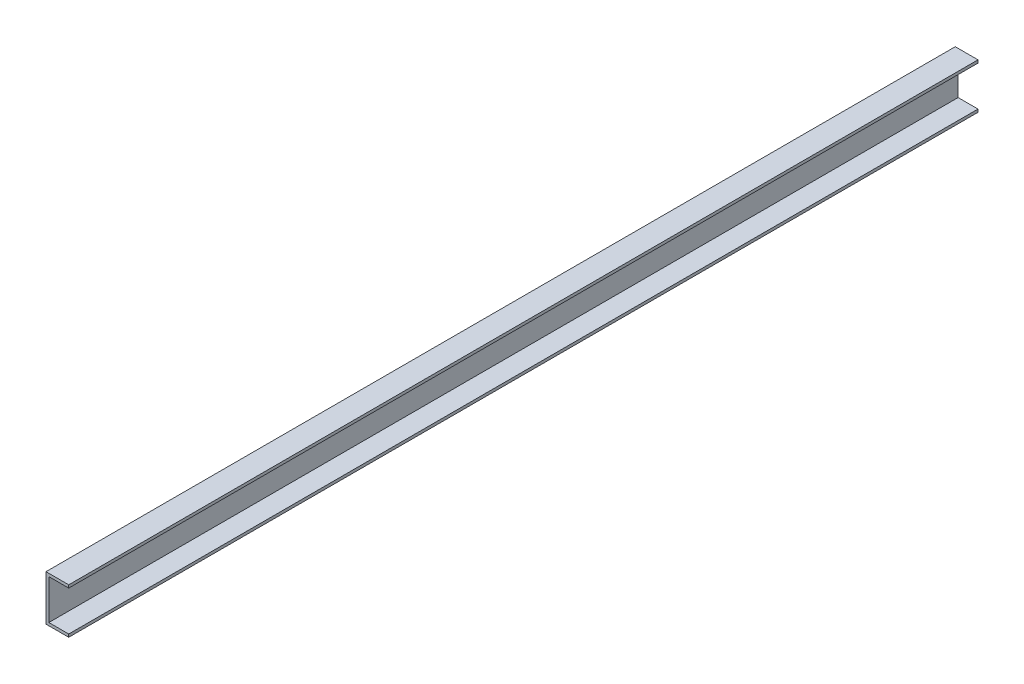
ISO-10303-21;
HEADER;
FILE_DESCRIPTION(('STEP AP214'),'2;1');
FILE_NAME('part.step','',(''),(''),'','','');
FILE_SCHEMA(('AUTOMOTIVE_DESIGN { 1 0 10303 214 1 1 1 1 }'));
ENDSEC;
DATA;
#1=APPLICATION_CONTEXT('core data for automotive mechanical design processes');
#2=APPLICATION_PROTOCOL_DEFINITION('international standard','automotive_design',2000,#1);
#3=PRODUCT_CONTEXT('',#1,'mechanical');
#4=PRODUCT('Part','Part','',(#3));
#5=PRODUCT_RELATED_PRODUCT_CATEGORY('part','',(#4));
#6=PRODUCT_DEFINITION_FORMATION('','',#4);
#7=PRODUCT_DEFINITION_CONTEXT('part definition',#1,'design');
#8=PRODUCT_DEFINITION('design','',#6,#7);
#9=PRODUCT_DEFINITION_SHAPE('','',#8);
#10=(LENGTH_UNIT() NAMED_UNIT(*) SI_UNIT(.MILLI.,.METRE.));
#11=(NAMED_UNIT(*) PLANE_ANGLE_UNIT() SI_UNIT($,.RADIAN.));
#12=(NAMED_UNIT(*) SI_UNIT($,.STERADIAN.) SOLID_ANGLE_UNIT());
#13=UNCERTAINTY_MEASURE_WITH_UNIT(LENGTH_MEASURE(1.E-05),#10,'distance_accuracy_value','');
#14=(GEOMETRIC_REPRESENTATION_CONTEXT(3) GLOBAL_UNCERTAINTY_ASSIGNED_CONTEXT((#13)) GLOBAL_UNIT_ASSIGNED_CONTEXT((#10,
#11,#12)) REPRESENTATION_CONTEXT('',''));
#15=CARTESIAN_POINT('',(0.,0.,0.));
#16=DIRECTION('',(0.,0.,1.));
#17=DIRECTION('',(1.,0.,0.));
#18=AXIS2_PLACEMENT_3D('',#15,#16,#17);
#19=CARTESIAN_POINT('',(0.,0.,1016.));
#20=DIRECTION('',(0.,1.,0.));
#21=DIRECTION('',(0.,0.,1.));
#22=AXIS2_PLACEMENT_3D('',#19,#20,#21);
#23=PLANE('',#22);
#24=DIRECTION('',(1.,0.,0.));
#25=VECTOR('',#24,1.);
#26=CARTESIAN_POINT('',(0.,0.,0.));
#27=LINE('',#26,#25);
#28=CARTESIAN_POINT('',(0.,0.,0.));
#29=VERTEX_POINT('',#28);
#30=CARTESIAN_POINT('',(25.4,0.,0.));
#31=VERTEX_POINT('',#30);
#32=EDGE_CURVE('E100',#29,#31,#27,.T.);
#33=ORIENTED_EDGE('',*,*,#32,.T.);
#34=DIRECTION('',(0.,0.,-1.));
#35=VECTOR('',#34,1.);
#36=CARTESIAN_POINT('',(25.4,0.,1016.));
#37=LINE('',#36,#35);
#38=CARTESIAN_POINT('',(25.4,0.,1016.));
#39=VERTEX_POINT('',#38);
#40=EDGE_CURVE('E11',#39,#31,#37,.T.);
#41=ORIENTED_EDGE('',*,*,#40,.F.);
#42=DIRECTION('',(1.,0.,0.));
#43=VECTOR('',#42,1.);
#44=CARTESIAN_POINT('',(0.,0.,1016.));
#45=LINE('',#44,#43);
#46=CARTESIAN_POINT('',(0.,0.,1016.));
#47=VERTEX_POINT('',#46);
#48=EDGE_CURVE('E127',#47,#39,#45,.T.);
#49=ORIENTED_EDGE('',*,*,#48,.F.);
#50=DIRECTION('',(0.,0.,-1.));
#51=VECTOR('',#50,1.);
#52=CARTESIAN_POINT('',(0.,0.,1016.));
#53=LINE('',#52,#51);
#54=EDGE_CURVE('E113',#47,#29,#53,.T.);
#55=ORIENTED_EDGE('',*,*,#54,.T.);
#56=EDGE_LOOP('',(#33,#41,#49,#55));
#57=FACE_BOUND('',#56,.T.);
#58=ADVANCED_FACE('F32',(#57),#23,.F.);
#59=CARTESIAN_POINT('',(25.4,0.,1016.));
#60=DIRECTION('',(-1.,0.,0.));
#61=DIRECTION('',(0.,0.,1.));
#62=AXIS2_PLACEMENT_3D('',#59,#60,#61);
#63=PLANE('',#62);
#64=DIRECTION('',(0.,1.,0.));
#65=VECTOR('',#64,1.);
#66=CARTESIAN_POINT('',(25.4,0.,0.));
#67=LINE('',#66,#65);
#68=CARTESIAN_POINT('',(25.4,3.17499999999999,0.));
#69=VERTEX_POINT('',#68);
#70=EDGE_CURVE('E96',#31,#69,#67,.T.);
#71=ORIENTED_EDGE('',*,*,#70,.T.);
#72=DIRECTION('',(0.,0.,-1.));
#73=VECTOR('',#72,1.);
#74=CARTESIAN_POINT('',(25.4,3.17499999999999,1016.));
#75=LINE('',#74,#73);
#76=CARTESIAN_POINT('',(25.4,3.17499999999999,1016.));
#77=VERTEX_POINT('',#76);
#78=EDGE_CURVE('E39',#77,#69,#75,.T.);
#79=ORIENTED_EDGE('',*,*,#78,.F.);
#80=DIRECTION('',(0.,1.,0.));
#81=VECTOR('',#80,1.);
#82=CARTESIAN_POINT('',(25.4,0.,1016.));
#83=LINE('',#82,#81);
#84=EDGE_CURVE('E109',#39,#77,#83,.T.);
#85=ORIENTED_EDGE('',*,*,#84,.F.);
#86=ORIENTED_EDGE('',*,*,#40,.T.);
#87=EDGE_LOOP('',(#71,#79,#85,#86));
#88=FACE_BOUND('',#87,.T.);
#89=ADVANCED_FACE('F108',(#88),#63,.F.);
#90=CARTESIAN_POINT('',(25.4,3.17499999999999,1016.));
#91=DIRECTION('',(0.,-1.,0.));
#92=DIRECTION('',(1.,0.,0.));
#93=AXIS2_PLACEMENT_3D('',#90,#91,#92);
#94=PLANE('',#93);
#95=DIRECTION('',(-1.,0.,0.));
#96=VECTOR('',#95,1.);
#97=CARTESIAN_POINT('',(25.4,3.17499999999999,0.));
#98=LINE('',#97,#96);
#99=CARTESIAN_POINT('',(3.175,3.17499999999999,0.));
#100=VERTEX_POINT('',#99);
#101=EDGE_CURVE('E102',#69,#100,#98,.T.);
#102=ORIENTED_EDGE('',*,*,#101,.T.);
#103=DIRECTION('',(0.,0.,-1.));
#104=VECTOR('',#103,1.);
#105=CARTESIAN_POINT('',(3.175,3.17499999999999,1016.));
#106=LINE('',#105,#104);
#107=CARTESIAN_POINT('',(3.175,3.17499999999999,1016.));
#108=VERTEX_POINT('',#107);
#109=EDGE_CURVE('E153',#108,#100,#106,.T.);
#110=ORIENTED_EDGE('',*,*,#109,.F.);
#111=DIRECTION('',(-1.,0.,0.));
#112=VECTOR('',#111,1.);
#113=CARTESIAN_POINT('',(25.4,3.17499999999999,1016.));
#114=LINE('',#113,#112);
#115=EDGE_CURVE('E130',#77,#108,#114,.T.);
#116=ORIENTED_EDGE('',*,*,#115,.F.);
#117=ORIENTED_EDGE('',*,*,#78,.T.);
#118=EDGE_LOOP('',(#102,#110,#116,#117));
#119=FACE_BOUND('',#118,.T.);
#120=ADVANCED_FACE('F157',(#119),#94,.F.);
#121=CARTESIAN_POINT('',(3.17499999999999,47.625,1016.));
#122=DIRECTION('',(-1.,0.,0.));
#123=DIRECTION('',(0.,-1.,0.));
#124=AXIS2_PLACEMENT_3D('',#121,#122,#123);
#125=PLANE('',#124);
#126=DIRECTION('',(0.,1.,0.));
#127=VECTOR('',#126,1.);
#128=CARTESIAN_POINT('',(3.17499999999999,47.625,0.));
#129=LINE('',#128,#127);
#130=CARTESIAN_POINT('',(3.17499999999999,47.625,0.));
#131=VERTEX_POINT('',#130);
#132=EDGE_CURVE('E117',#100,#131,#129,.T.);
#133=ORIENTED_EDGE('',*,*,#132,.T.);
#134=DIRECTION('',(0.,0.,-1.));
#135=VECTOR('',#134,1.);
#136=CARTESIAN_POINT('',(3.17499999999999,47.625,1016.));
#137=LINE('',#136,#135);
#138=CARTESIAN_POINT('',(3.17499999999999,47.625,1016.));
#139=VERTEX_POINT('',#138);
#140=EDGE_CURVE('E150',#139,#131,#137,.T.);
#141=ORIENTED_EDGE('',*,*,#140,.F.);
#142=DIRECTION('',(0.,1.,0.));
#143=VECTOR('',#142,1.);
#144=CARTESIAN_POINT('',(3.17499999999999,47.625,1016.));
#145=LINE('',#144,#143);
#146=EDGE_CURVE('E132',#108,#139,#145,.T.);
#147=ORIENTED_EDGE('',*,*,#146,.F.);
#148=ORIENTED_EDGE('',*,*,#109,.T.);
#149=EDGE_LOOP('',(#133,#141,#147,#148));
#150=FACE_BOUND('',#149,.T.);
#151=ADVANCED_FACE('F165',(#150),#125,.F.);
#152=CARTESIAN_POINT('',(25.4,47.625,1016.));
#153=DIRECTION('',(0.,1.,0.));
#154=DIRECTION('',(0.,0.,1.));
#155=AXIS2_PLACEMENT_3D('',#152,#153,#154);
#156=PLANE('',#155);
#157=DIRECTION('',(1.,0.,0.));
#158=VECTOR('',#157,1.);
#159=CARTESIAN_POINT('',(25.4,47.625,0.));
#160=LINE('',#159,#158);
#161=CARTESIAN_POINT('',(25.4,47.625,0.));
#162=VERTEX_POINT('',#161);
#163=EDGE_CURVE('E119',#131,#162,#160,.T.);
#164=ORIENTED_EDGE('',*,*,#163,.T.);
#165=DIRECTION('',(0.,0.,-1.));
#166=VECTOR('',#165,1.);
#167=CARTESIAN_POINT('',(25.4,47.625,1016.));
#168=LINE('',#167,#166);
#169=CARTESIAN_POINT('',(25.4,47.625,1016.));
#170=VERTEX_POINT('',#169);
#171=EDGE_CURVE('E147',#170,#162,#168,.T.);
#172=ORIENTED_EDGE('',*,*,#171,.F.);
#173=DIRECTION('',(1.,0.,0.));
#174=VECTOR('',#173,1.);
#175=CARTESIAN_POINT('',(25.4,47.625,1016.));
#176=LINE('',#175,#174);
#177=EDGE_CURVE('E134',#139,#170,#176,.T.);
#178=ORIENTED_EDGE('',*,*,#177,.F.);
#179=ORIENTED_EDGE('',*,*,#140,.T.);
#180=EDGE_LOOP('',(#164,#172,#178,#179));
#181=FACE_BOUND('',#180,.T.);
#182=ADVANCED_FACE('F168',(#181),#156,.F.);
#183=CARTESIAN_POINT('',(25.4,50.8,1016.));
#184=DIRECTION('',(-1.,0.,0.));
#185=DIRECTION('',(0.,-1.,0.));
#186=AXIS2_PLACEMENT_3D('',#183,#184,#185);
#187=PLANE('',#186);
#188=DIRECTION('',(0.,1.,0.));
#189=VECTOR('',#188,1.);
#190=CARTESIAN_POINT('',(25.4,50.8,0.));
#191=LINE('',#190,#189);
#192=CARTESIAN_POINT('',(25.4,50.8,0.));
#193=VERTEX_POINT('',#192);
#194=EDGE_CURVE('E121',#162,#193,#191,.T.);
#195=ORIENTED_EDGE('',*,*,#194,.T.);
#196=DIRECTION('',(0.,0.,-1.));
#197=VECTOR('',#196,1.);
#198=CARTESIAN_POINT('',(25.4,50.8,1016.));
#199=LINE('',#198,#197);
#200=CARTESIAN_POINT('',(25.4,50.8,1016.));
#201=VERTEX_POINT('',#200);
#202=EDGE_CURVE('E144',#201,#193,#199,.T.);
#203=ORIENTED_EDGE('',*,*,#202,.F.);
#204=DIRECTION('',(0.,1.,0.));
#205=VECTOR('',#204,1.);
#206=CARTESIAN_POINT('',(25.4,50.8,1016.));
#207=LINE('',#206,#205);
#208=EDGE_CURVE('E136',#170,#201,#207,.T.);
#209=ORIENTED_EDGE('',*,*,#208,.F.);
#210=ORIENTED_EDGE('',*,*,#171,.T.);
#211=EDGE_LOOP('',(#195,#203,#209,#210));
#212=FACE_BOUND('',#211,.T.);
#213=ADVANCED_FACE('F173',(#212),#187,.F.);
#214=CARTESIAN_POINT('',(0.,50.8,1016.));
#215=DIRECTION('',(0.,-1.,0.));
#216=DIRECTION('',(0.,0.,-1.));
#217=AXIS2_PLACEMENT_3D('',#214,#215,#216);
#218=PLANE('',#217);
#219=DIRECTION('',(-1.,0.,0.));
#220=VECTOR('',#219,1.);
#221=CARTESIAN_POINT('',(0.,50.8,0.));
#222=LINE('',#221,#220);
#223=CARTESIAN_POINT('',(0.,50.8,0.));
#224=VERTEX_POINT('',#223);
#225=EDGE_CURVE('E123',#193,#224,#222,.T.);
#226=ORIENTED_EDGE('',*,*,#225,.T.);
#227=DIRECTION('',(0.,0.,-1.));
#228=VECTOR('',#227,1.);
#229=CARTESIAN_POINT('',(0.,50.8,1016.));
#230=LINE('',#229,#228);
#231=CARTESIAN_POINT('',(0.,50.8,1016.));
#232=VERTEX_POINT('',#231);
#233=EDGE_CURVE('E141',#232,#224,#230,.T.);
#234=ORIENTED_EDGE('',*,*,#233,.F.);
#235=DIRECTION('',(-1.,0.,0.));
#236=VECTOR('',#235,1.);
#237=CARTESIAN_POINT('',(0.,50.8,1016.));
#238=LINE('',#237,#236);
#239=EDGE_CURVE('E51',#201,#232,#238,.T.);
#240=ORIENTED_EDGE('',*,*,#239,.F.);
#241=ORIENTED_EDGE('',*,*,#202,.T.);
#242=EDGE_LOOP('',(#226,#234,#240,#241));
#243=FACE_BOUND('',#242,.T.);
#244=ADVANCED_FACE('F176',(#243),#218,.F.);
#245=CARTESIAN_POINT('',(0.,0.,1016.));
#246=DIRECTION('',(1.,0.,0.));
#247=DIRECTION('',(0.,1.,0.));
#248=AXIS2_PLACEMENT_3D('',#245,#246,#247);
#249=PLANE('',#248);
#250=DIRECTION('',(0.,-1.,0.));
#251=VECTOR('',#250,1.);
#252=CARTESIAN_POINT('',(0.,0.,0.));
#253=LINE('',#252,#251);
#254=EDGE_CURVE('E125',#224,#29,#253,.T.);
#255=ORIENTED_EDGE('',*,*,#254,.T.);
#256=ORIENTED_EDGE('',*,*,#54,.F.);
#257=DIRECTION('',(0.,-1.,0.));
#258=VECTOR('',#257,1.);
#259=CARTESIAN_POINT('',(0.,0.,1016.));
#260=LINE('',#259,#258);
#261=EDGE_CURVE('E46',#232,#47,#260,.T.);
#262=ORIENTED_EDGE('',*,*,#261,.F.);
#263=ORIENTED_EDGE('',*,*,#233,.T.);
#264=EDGE_LOOP('',(#255,#256,#262,#263));
#265=FACE_BOUND('',#264,.T.);
#266=ADVANCED_FACE('F178',(#265),#249,.F.);
#267=CARTESIAN_POINT('',(25.4,0.,1016.));
#268=DIRECTION('',(0.,0.,1.));
#269=DIRECTION('',(1.,0.,0.));
#270=AXIS2_PLACEMENT_3D('',#267,#268,#269);
#271=PLANE('',#270);
#272=ORIENTED_EDGE('',*,*,#48,.T.);
#273=ORIENTED_EDGE('',*,*,#84,.T.);
#274=ORIENTED_EDGE('',*,*,#115,.T.);
#275=ORIENTED_EDGE('',*,*,#146,.T.);
#276=ORIENTED_EDGE('',*,*,#177,.T.);
#277=ORIENTED_EDGE('',*,*,#208,.T.);
#278=ORIENTED_EDGE('',*,*,#239,.T.);
#279=ORIENTED_EDGE('',*,*,#261,.T.);
#280=EDGE_LOOP('',(#272,#273,#274,#275,#276,#277,#278,#279));
#281=FACE_BOUND('',#280,.T.);
#282=ADVANCED_FACE('F160',(#281),#271,.T.);
#283=CARTESIAN_POINT('',(25.4,0.,0.));
#284=DIRECTION('',(0.,0.,1.));
#285=DIRECTION('',(1.,0.,0.));
#286=AXIS2_PLACEMENT_3D('',#283,#284,#285);
#287=PLANE('',#286);
#288=ORIENTED_EDGE('',*,*,#32,.F.);
#289=ORIENTED_EDGE('',*,*,#254,.F.);
#290=ORIENTED_EDGE('',*,*,#225,.F.);
#291=ORIENTED_EDGE('',*,*,#194,.F.);
#292=ORIENTED_EDGE('',*,*,#163,.F.);
#293=ORIENTED_EDGE('',*,*,#132,.F.);
#294=ORIENTED_EDGE('',*,*,#101,.F.);
#295=ORIENTED_EDGE('',*,*,#70,.F.);
#296=EDGE_LOOP('',(#288,#289,#290,#291,#292,#293,#294,#295));
#297=FACE_BOUND('',#296,.T.);
#298=ADVANCED_FACE('F97',(#297),#287,.F.);
#299=CLOSED_SHELL('',(#58,#89,#120,#151,#182,#213,#244,#266,#282,#298));
#300=MANIFOLD_SOLID_BREP('B2',#299);
#301=ADVANCED_BREP_SHAPE_REPRESENTATION('',(#18,#300),#14);
#302=SHAPE_DEFINITION_REPRESENTATION(#9,#301);
ENDSEC;
END-ISO-10303-21;
